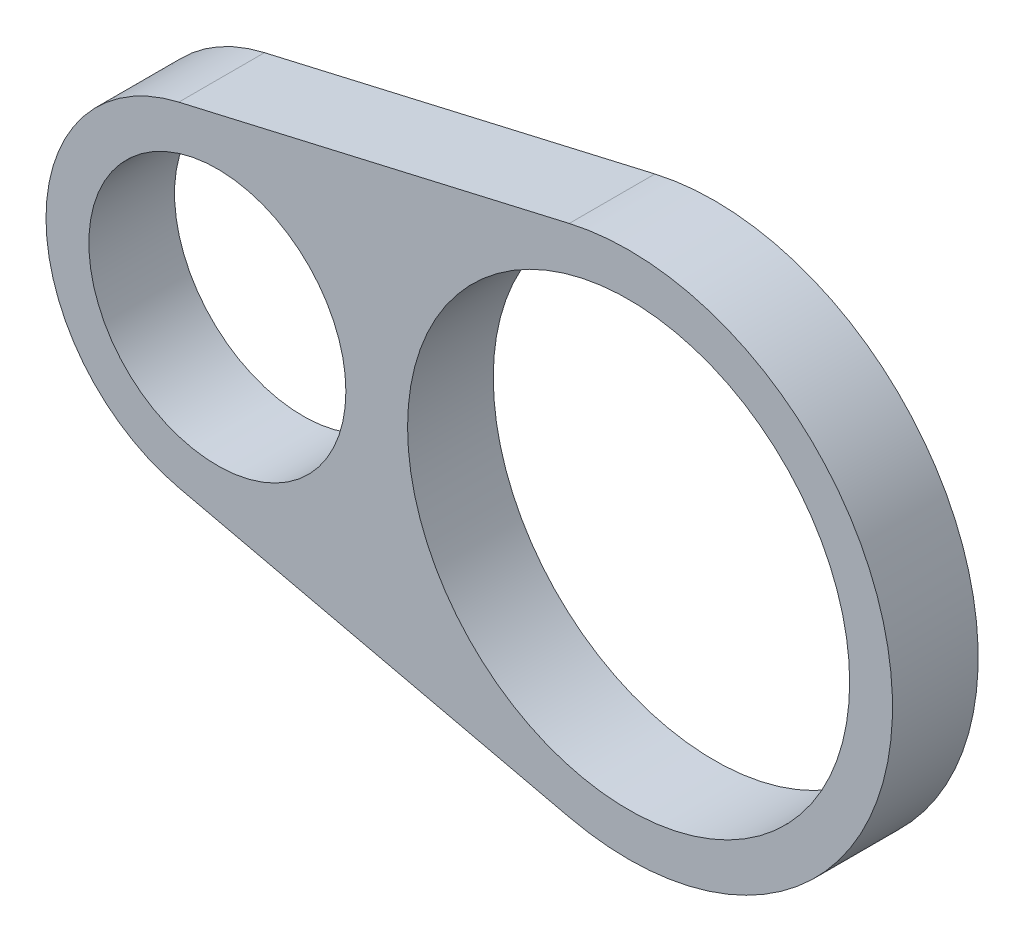
ISO-10303-21;
HEADER;
FILE_DESCRIPTION(('STEP AP214'),'2;1');
FILE_NAME('part.step','',(''),(''),'','','');
FILE_SCHEMA(('AUTOMOTIVE_DESIGN { 1 0 10303 214 1 1 1 1 }'));
ENDSEC;
DATA;
#1=APPLICATION_CONTEXT('core data for automotive mechanical design processes');
#2=APPLICATION_PROTOCOL_DEFINITION('international standard','automotive_design',2000,#1);
#3=PRODUCT_CONTEXT('',#1,'mechanical');
#4=PRODUCT('Part','Part','',(#3));
#5=PRODUCT_RELATED_PRODUCT_CATEGORY('part','',(#4));
#6=PRODUCT_DEFINITION_FORMATION('','',#4);
#7=PRODUCT_DEFINITION_CONTEXT('part definition',#1,'design');
#8=PRODUCT_DEFINITION('design','',#6,#7);
#9=PRODUCT_DEFINITION_SHAPE('','',#8);
#10=(LENGTH_UNIT() NAMED_UNIT(*) SI_UNIT(.MILLI.,.METRE.));
#11=(NAMED_UNIT(*) PLANE_ANGLE_UNIT() SI_UNIT($,.RADIAN.));
#12=(NAMED_UNIT(*) SI_UNIT($,.STERADIAN.) SOLID_ANGLE_UNIT());
#13=UNCERTAINTY_MEASURE_WITH_UNIT(LENGTH_MEASURE(1.E-05),#10,'distance_accuracy_value','');
#14=(GEOMETRIC_REPRESENTATION_CONTEXT(3) GLOBAL_UNCERTAINTY_ASSIGNED_CONTEXT((#13)) GLOBAL_UNIT_ASSIGNED_CONTEXT((#10,
#11,#12)) REPRESENTATION_CONTEXT('',''));
#15=CARTESIAN_POINT('',(0.,0.,0.));
#16=DIRECTION('',(0.,0.,1.));
#17=DIRECTION('',(1.,0.,0.));
#18=AXIS2_PLACEMENT_3D('',#15,#16,#17);
#19=CARTESIAN_POINT('',(-5.71500000000001,-24.7487125927795,10.));
#20=DIRECTION('',(0.225,0.974358763495254,0.));
#21=DIRECTION('',(-0.974358763495254,0.225,0.));
#22=AXIS2_PLACEMENT_3D('',#19,#20,#21);
#23=PLANE('',#22);
#24=DIRECTION('',(0.974358763495254,-0.225,0.));
#25=VECTOR('',#24,1.);
#26=CARTESIAN_POINT('',(-5.71500000000001,-24.7487125927795,0.));
#27=LINE('',#26,#25);
#28=CARTESIAN_POINT('',(-28.5,-19.4871752699051,0.));
#29=VERTEX_POINT('',#28);
#30=CARTESIAN_POINT('',(17.07,-30.0102499156538,0.));
#31=VERTEX_POINT('',#30);
#32=EDGE_CURVE('E105',#29,#31,#27,.T.);
#33=ORIENTED_EDGE('',*,*,#32,.T.);
#34=DIRECTION('',(0.,0.,-1.));
#35=VECTOR('',#34,1.);
#36=CARTESIAN_POINT('',(17.07,-30.0102499156538,10.));
#37=LINE('',#36,#35);
#38=CARTESIAN_POINT('',(17.07,-30.0102499156538,10.));
#39=VERTEX_POINT('',#38);
#40=EDGE_CURVE('E11',#39,#31,#37,.T.);
#41=ORIENTED_EDGE('',*,*,#40,.F.);
#42=DIRECTION('',(0.974358763495254,-0.225,0.));
#43=VECTOR('',#42,1.);
#44=CARTESIAN_POINT('',(-5.71500000000001,-24.7487125927795,10.));
#45=LINE('',#44,#43);
#46=CARTESIAN_POINT('',(-28.5,-19.4871752699051,10.));
#47=VERTEX_POINT('',#46);
#48=EDGE_CURVE('E84',#47,#39,#45,.T.);
#49=ORIENTED_EDGE('',*,*,#48,.F.);
#50=DIRECTION('',(0.,0.,-1.));
#51=VECTOR('',#50,1.);
#52=CARTESIAN_POINT('',(-28.5,-19.4871752699051,10.));
#53=LINE('',#52,#51);
#54=EDGE_CURVE('E104',#47,#29,#53,.T.);
#55=ORIENTED_EDGE('',*,*,#54,.T.);
#56=EDGE_LOOP('',(#33,#41,#49,#55));
#57=FACE_BOUND('',#56,.T.);
#58=ADVANCED_FACE('F36',(#57),#23,.F.);
#59=CARTESIAN_POINT('',(24.,0.,10.));
#60=DIRECTION('',(0.,0.,-1.));
#61=DIRECTION('',(-1.,0.,0.));
#62=AXIS2_PLACEMENT_3D('',#59,#60,#61);
#63=CYLINDRICAL_SURFACE('',#62,30.8);
#64=CARTESIAN_POINT('',(24.,0.,0.));
#65=DIRECTION('',(0.,0.,1.));
#66=DIRECTION('',(1.,0.,0.));
#67=AXIS2_PLACEMENT_3D('',#64,#65,#66);
#68=CIRCLE('',#67,30.8);
#69=CARTESIAN_POINT('',(17.07,30.0102499156538,0.));
#70=VERTEX_POINT('',#69);
#71=EDGE_CURVE('E89',#31,#70,#68,.T.);
#72=ORIENTED_EDGE('',*,*,#71,.T.);
#73=DIRECTION('',(0.,0.,-1.));
#74=VECTOR('',#73,1.);
#75=CARTESIAN_POINT('',(17.07,30.0102499156538,10.));
#76=LINE('',#75,#74);
#77=CARTESIAN_POINT('',(17.07,30.0102499156538,10.));
#78=VERTEX_POINT('',#77);
#79=EDGE_CURVE('E44',#78,#70,#76,.T.);
#80=ORIENTED_EDGE('',*,*,#79,.F.);
#81=CARTESIAN_POINT('',(24.,0.,10.));
#82=DIRECTION('',(0.,0.,1.));
#83=DIRECTION('',(1.,0.,0.));
#84=AXIS2_PLACEMENT_3D('',#81,#82,#83);
#85=CIRCLE('',#84,30.8);
#86=EDGE_CURVE('E78',#39,#78,#85,.T.);
#87=ORIENTED_EDGE('',*,*,#86,.F.);
#88=ORIENTED_EDGE('',*,*,#40,.T.);
#89=EDGE_LOOP('',(#72,#80,#87,#88));
#90=FACE_BOUND('',#89,.T.);
#91=ADVANCED_FACE('F88',(#90),#63,.T.);
#92=CARTESIAN_POINT('',(-5.71500000000001,24.7487125927795,10.));
#93=DIRECTION('',(-0.225,0.974358763495254,0.));
#94=DIRECTION('',(-0.974358763495254,-0.225,0.));
#95=AXIS2_PLACEMENT_3D('',#92,#93,#94);
#96=PLANE('',#95);
#97=DIRECTION('',(0.974358763495254,0.225,0.));
#98=VECTOR('',#97,1.);
#99=CARTESIAN_POINT('',(-5.71500000000001,24.7487125927795,0.));
#100=LINE('',#99,#98);
#101=CARTESIAN_POINT('',(-28.5,19.4871752699051,0.));
#102=VERTEX_POINT('',#101);
#103=EDGE_CURVE('E109',#102,#70,#100,.T.);
#104=ORIENTED_EDGE('',*,*,#103,.F.);
#105=DIRECTION('',(0.,0.,-1.));
#106=VECTOR('',#105,1.);
#107=CARTESIAN_POINT('',(-28.5,19.4871752699051,10.));
#108=LINE('',#107,#106);
#109=CARTESIAN_POINT('',(-28.5,19.4871752699051,10.));
#110=VERTEX_POINT('',#109);
#111=EDGE_CURVE('E68',#110,#102,#108,.T.);
#112=ORIENTED_EDGE('',*,*,#111,.F.);
#113=DIRECTION('',(0.974358763495254,0.225,0.));
#114=VECTOR('',#113,1.);
#115=CARTESIAN_POINT('',(-5.71500000000001,24.7487125927795,10.));
#116=LINE('',#115,#114);
#117=EDGE_CURVE('E82',#110,#78,#116,.T.);
#118=ORIENTED_EDGE('',*,*,#117,.T.);
#119=ORIENTED_EDGE('',*,*,#79,.T.);
#120=EDGE_LOOP('',(#104,#112,#118,#119));
#121=FACE_BOUND('',#120,.T.);
#122=ADVANCED_FACE('F93',(#121),#96,.T.);
#123=CARTESIAN_POINT('',(24.,0.,10.));
#124=DIRECTION('',(0.,0.,-1.));
#125=DIRECTION('',(-1.,0.,0.));
#126=AXIS2_PLACEMENT_3D('',#123,#124,#125);
#127=CYLINDRICAL_SURFACE('',#126,25.8);
#128=CARTESIAN_POINT('',(24.,0.,10.));
#129=DIRECTION('',(0.,0.,1.));
#130=DIRECTION('',(1.,0.,0.));
#131=AXIS2_PLACEMENT_3D('',#128,#129,#130);
#132=CIRCLE('',#131,25.8);
#133=CARTESIAN_POINT('',(49.8,0.,10.));
#134=VERTEX_POINT('',#133);
#135=EDGE_CURVE('E95',#134,#134,#132,.T.);
#136=ORIENTED_EDGE('',*,*,#135,.T.);
#137=EDGE_LOOP('',(#136));
#138=FACE_BOUND('',#137,.T.);
#139=CARTESIAN_POINT('',(24.,0.,0.));
#140=DIRECTION('',(0.,0.,1.));
#141=DIRECTION('',(1.,0.,0.));
#142=AXIS2_PLACEMENT_3D('',#139,#140,#141);
#143=CIRCLE('',#142,25.8);
#144=CARTESIAN_POINT('',(49.8,0.,0.));
#145=VERTEX_POINT('',#144);
#146=EDGE_CURVE('E112',#145,#145,#143,.T.);
#147=ORIENTED_EDGE('',*,*,#146,.F.);
#148=EDGE_LOOP('',(#147));
#149=FACE_BOUND('',#148,.T.);
#150=ADVANCED_FACE('F140',(#138,#149),#127,.F.);
#151=CARTESIAN_POINT('',(-24.,0.,10.));
#152=DIRECTION('',(0.,0.,-1.));
#153=DIRECTION('',(-1.,0.,0.));
#154=AXIS2_PLACEMENT_3D('',#151,#152,#153);
#155=CYLINDRICAL_SURFACE('',#154,20.);
#156=CARTESIAN_POINT('',(-24.,0.,0.));
#157=DIRECTION('',(0.,0.,1.));
#158=DIRECTION('',(1.,0.,0.));
#159=AXIS2_PLACEMENT_3D('',#156,#157,#158);
#160=CIRCLE('',#159,20.);
#161=EDGE_CURVE('E71',#102,#29,#160,.T.);
#162=ORIENTED_EDGE('',*,*,#161,.T.);
#163=ORIENTED_EDGE('',*,*,#54,.F.);
#164=CARTESIAN_POINT('',(-24.,0.,10.));
#165=DIRECTION('',(0.,0.,1.));
#166=DIRECTION('',(1.,0.,0.));
#167=AXIS2_PLACEMENT_3D('',#164,#165,#166);
#168=CIRCLE('',#167,20.);
#169=EDGE_CURVE('E52',#110,#47,#168,.T.);
#170=ORIENTED_EDGE('',*,*,#169,.F.);
#171=ORIENTED_EDGE('',*,*,#111,.T.);
#172=EDGE_LOOP('',(#162,#163,#170,#171));
#173=FACE_BOUND('',#172,.T.);
#174=ADVANCED_FACE('F132',(#173),#155,.T.);
#175=CARTESIAN_POINT('',(-24.,0.,10.));
#176=DIRECTION('',(0.,0.,-1.));
#177=DIRECTION('',(-1.,0.,0.));
#178=AXIS2_PLACEMENT_3D('',#175,#176,#177);
#179=CYLINDRICAL_SURFACE('',#178,15.);
#180=CARTESIAN_POINT('',(-24.,0.,10.));
#181=DIRECTION('',(0.,0.,1.));
#182=DIRECTION('',(1.,0.,0.));
#183=AXIS2_PLACEMENT_3D('',#180,#181,#182);
#184=CIRCLE('',#183,15.);
#185=CARTESIAN_POINT('',(-9.,0.,10.));
#186=VERTEX_POINT('',#185);
#187=EDGE_CURVE('E101',#186,#186,#184,.T.);
#188=ORIENTED_EDGE('',*,*,#187,.T.);
#189=EDGE_LOOP('',(#188));
#190=FACE_BOUND('',#189,.T.);
#191=CARTESIAN_POINT('',(-24.,0.,0.));
#192=DIRECTION('',(0.,0.,1.));
#193=DIRECTION('',(1.,0.,0.));
#194=AXIS2_PLACEMENT_3D('',#191,#192,#193);
#195=CIRCLE('',#194,15.);
#196=CARTESIAN_POINT('',(-9.,0.,0.));
#197=VERTEX_POINT('',#196);
#198=EDGE_CURVE('E115',#197,#197,#195,.T.);
#199=ORIENTED_EDGE('',*,*,#198,.F.);
#200=EDGE_LOOP('',(#199));
#201=FACE_BOUND('',#200,.T.);
#202=ADVANCED_FACE('F130',(#190,#201),#179,.F.);
#203=CARTESIAN_POINT('',(0.,0.,10.));
#204=DIRECTION('',(0.,0.,1.));
#205=DIRECTION('',(1.,0.,0.));
#206=AXIS2_PLACEMENT_3D('',#203,#204,#205);
#207=PLANE('',#206);
#208=ORIENTED_EDGE('',*,*,#48,.T.);
#209=ORIENTED_EDGE('',*,*,#86,.T.);
#210=ORIENTED_EDGE('',*,*,#117,.F.);
#211=ORIENTED_EDGE('',*,*,#169,.T.);
#212=EDGE_LOOP('',(#208,#209,#210,#211));
#213=FACE_BOUND('',#212,.T.);
#214=ORIENTED_EDGE('',*,*,#135,.F.);
#215=EDGE_LOOP('',(#214));
#216=FACE_BOUND('',#215,.T.);
#217=ORIENTED_EDGE('',*,*,#187,.F.);
#218=EDGE_LOOP('',(#217));
#219=FACE_BOUND('',#218,.T.);
#220=ADVANCED_FACE('F79',(#213,#216,#219),#207,.T.);
#221=CARTESIAN_POINT('',(0.,0.,0.));
#222=DIRECTION('',(0.,0.,1.));
#223=DIRECTION('',(1.,0.,0.));
#224=AXIS2_PLACEMENT_3D('',#221,#222,#223);
#225=PLANE('',#224);
#226=ORIENTED_EDGE('',*,*,#32,.F.);
#227=ORIENTED_EDGE('',*,*,#161,.F.);
#228=ORIENTED_EDGE('',*,*,#103,.T.);
#229=ORIENTED_EDGE('',*,*,#71,.F.);
#230=EDGE_LOOP('',(#226,#227,#228,#229));
#231=FACE_BOUND('',#230,.T.);
#232=ORIENTED_EDGE('',*,*,#146,.T.);
#233=EDGE_LOOP('',(#232));
#234=FACE_BOUND('',#233,.T.);
#235=ORIENTED_EDGE('',*,*,#198,.T.);
#236=EDGE_LOOP('',(#235));
#237=FACE_BOUND('',#236,.T.);
#238=ADVANCED_FACE('F122',(#231,#234,#237),#225,.F.);
#239=CLOSED_SHELL('',(#58,#91,#122,#150,#174,#202,#220,#238));
#240=MANIFOLD_SOLID_BREP('B2',#239);
#241=ADVANCED_BREP_SHAPE_REPRESENTATION('',(#18,#240),#14);
#242=SHAPE_DEFINITION_REPRESENTATION(#9,#241);
ENDSEC;
END-ISO-10303-21;
